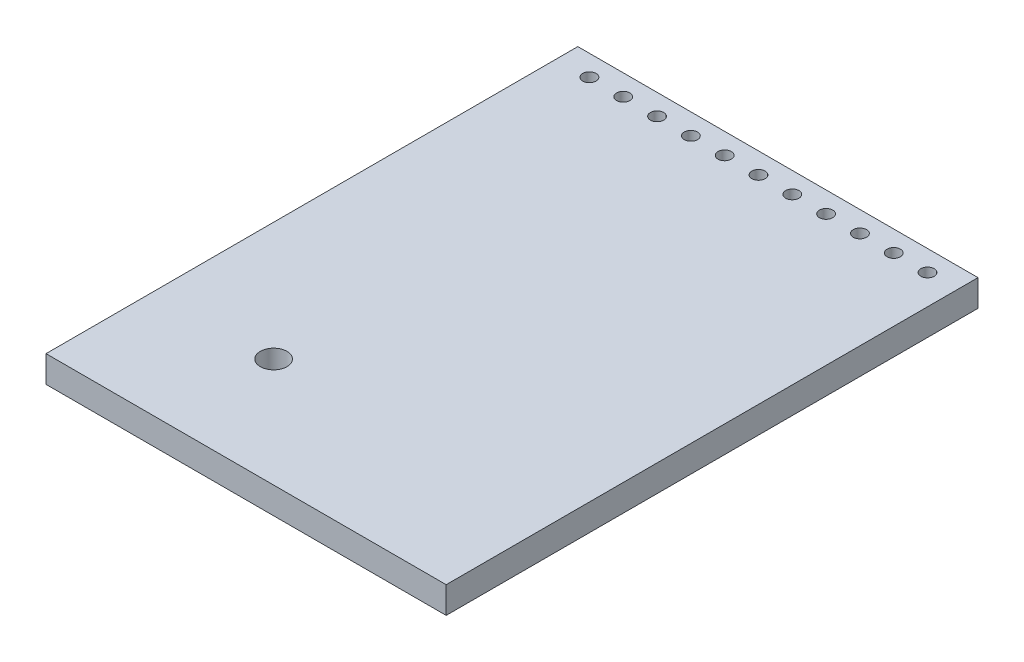
ISO-10303-21;
HEADER;
FILE_DESCRIPTION(('STEP AP214'),'2;1');
FILE_NAME('part.step','',(''),(''),'','','');
FILE_SCHEMA(('AUTOMOTIVE_DESIGN { 1 0 10303 214 1 1 1 1 }'));
ENDSEC;
DATA;
#1=APPLICATION_CONTEXT('core data for automotive mechanical design processes');
#2=APPLICATION_PROTOCOL_DEFINITION('international standard','automotive_design',2000,#1);
#3=PRODUCT_CONTEXT('',#1,'mechanical');
#4=PRODUCT('Part','Part','',(#3));
#5=PRODUCT_RELATED_PRODUCT_CATEGORY('part','',(#4));
#6=PRODUCT_DEFINITION_FORMATION('','',#4);
#7=PRODUCT_DEFINITION_CONTEXT('part definition',#1,'design');
#8=PRODUCT_DEFINITION('design','',#6,#7);
#9=PRODUCT_DEFINITION_SHAPE('','',#8);
#10=(LENGTH_UNIT() NAMED_UNIT(*) SI_UNIT(.MILLI.,.METRE.));
#11=(NAMED_UNIT(*) PLANE_ANGLE_UNIT() SI_UNIT($,.RADIAN.));
#12=(NAMED_UNIT(*) SI_UNIT($,.STERADIAN.) SOLID_ANGLE_UNIT());
#13=UNCERTAINTY_MEASURE_WITH_UNIT(LENGTH_MEASURE(1.E-05),#10,'distance_accuracy_value','');
#14=(GEOMETRIC_REPRESENTATION_CONTEXT(3) GLOBAL_UNCERTAINTY_ASSIGNED_CONTEXT((#13)) GLOBAL_UNIT_ASSIGNED_CONTEXT((#10,
#11,#12)) REPRESENTATION_CONTEXT('',''));
#15=CARTESIAN_POINT('',(0.,0.,0.));
#16=DIRECTION('',(0.,0.,1.));
#17=DIRECTION('',(1.,0.,0.));
#18=AXIS2_PLACEMENT_3D('',#15,#16,#17);
#19=CARTESIAN_POINT('',(0.,0.,39.95));
#20=DIRECTION('',(0.,1.,0.));
#21=DIRECTION('',(0.,0.,1.));
#22=AXIS2_PLACEMENT_3D('',#19,#20,#21);
#23=PLANE('',#22);
#24=DIRECTION('',(0.,0.,1.));
#25=VECTOR('',#24,1.);
#26=CARTESIAN_POINT('',(14.71,0.,37.2));
#27=LINE('',#26,#25);
#28=CARTESIAN_POINT('',(14.71,0.,35.2));
#29=VERTEX_POINT('',#28);
#30=CARTESIAN_POINT('',(14.71,0.,37.2));
#31=VERTEX_POINT('',#30);
#32=EDGE_CURVE('E149',#29,#31,#27,.T.);
#33=ORIENTED_EDGE('',*,*,#32,.F.);
#34=DIRECTION('',(1.,0.,0.));
#35=VECTOR('',#34,1.);
#36=CARTESIAN_POINT('',(14.71,0.,35.2));
#37=LINE('',#36,#35);
#38=CARTESIAN_POINT('',(13.41,0.,35.2));
#39=VERTEX_POINT('',#38);
#40=EDGE_CURVE('E162',#39,#29,#37,.T.);
#41=ORIENTED_EDGE('',*,*,#40,.F.);
#42=DIRECTION('',(0.,0.,-1.));
#43=VECTOR('',#42,1.);
#44=CARTESIAN_POINT('',(13.41,0.,37.2));
#45=LINE('',#44,#43);
#46=CARTESIAN_POINT('',(13.41,0.,37.2));
#47=VERTEX_POINT('',#46);
#48=EDGE_CURVE('E171',#47,#39,#45,.T.);
#49=ORIENTED_EDGE('',*,*,#48,.F.);
#50=DIRECTION('',(-1.,0.,0.));
#51=VECTOR('',#50,1.);
#52=CARTESIAN_POINT('',(14.71,0.,37.2));
#53=LINE('',#52,#51);
#54=EDGE_CURVE('E152',#31,#47,#53,.T.);
#55=ORIENTED_EDGE('',*,*,#54,.F.);
#56=EDGE_LOOP('',(#33,#41,#49,#55));
#57=FACE_BOUND('',#56,.T.);
#58=CARTESIAN_POINT('',(25.29,0.,1.56));
#59=DIRECTION('',(0.,1.,0.));
#60=DIRECTION('',(0.,0.,1.));
#61=AXIS2_PLACEMENT_3D('',#58,#59,#60);
#62=CIRCLE('',#61,0.499999999999999);
#63=CARTESIAN_POINT('',(25.29,0.,2.06));
#64=VERTEX_POINT('',#63);
#65=EDGE_CURVE('E190',#64,#64,#62,.T.);
#66=ORIENTED_EDGE('',*,*,#65,.T.);
#67=EDGE_LOOP('',(#66));
#68=FACE_BOUND('',#67,.T.);
#69=CARTESIAN_POINT('',(27.83,0.,1.56));
#70=DIRECTION('',(0.,1.,0.));
#71=DIRECTION('',(0.,0.,1.));
#72=AXIS2_PLACEMENT_3D('',#69,#70,#71);
#73=CIRCLE('',#72,0.499999999999999);
#74=CARTESIAN_POINT('',(27.83,0.,2.06));
#75=VERTEX_POINT('',#74);
#76=EDGE_CURVE('E196',#75,#75,#73,.T.);
#77=ORIENTED_EDGE('',*,*,#76,.T.);
#78=EDGE_LOOP('',(#77));
#79=FACE_BOUND('',#78,.T.);
#80=CARTESIAN_POINT('',(8.9,0.,31.75));
#81=DIRECTION('',(0.,1.,0.));
#82=DIRECTION('',(0.,0.,1.));
#83=AXIS2_PLACEMENT_3D('',#80,#81,#82);
#84=CIRCLE('',#83,1.);
#85=CARTESIAN_POINT('',(8.9,0.,32.75));
#86=VERTEX_POINT('',#85);
#87=EDGE_CURVE('E202',#86,#86,#84,.T.);
#88=ORIENTED_EDGE('',*,*,#87,.T.);
#89=EDGE_LOOP('',(#88));
#90=FACE_BOUND('',#89,.T.);
#91=DIRECTION('',(1.,0.,0.));
#92=VECTOR('',#91,1.);
#93=CARTESIAN_POINT('',(0.,0.,0.));
#94=LINE('',#93,#92);
#95=CARTESIAN_POINT('',(0.,0.,0.));
#96=VERTEX_POINT('',#95);
#97=CARTESIAN_POINT('',(30.06,0.,0.));
#98=VERTEX_POINT('',#97);
#99=EDGE_CURVE('E219',#96,#98,#94,.T.);
#100=ORIENTED_EDGE('',*,*,#99,.T.);
#101=DIRECTION('',(0.,0.,-1.));
#102=VECTOR('',#101,1.);
#103=CARTESIAN_POINT('',(30.06,0.,39.95));
#104=LINE('',#103,#102);
#105=CARTESIAN_POINT('',(30.06,0.,39.95));
#106=VERTEX_POINT('',#105);
#107=EDGE_CURVE('E229',#106,#98,#104,.T.);
#108=ORIENTED_EDGE('',*,*,#107,.F.);
#109=DIRECTION('',(1.,0.,0.));
#110=VECTOR('',#109,1.);
#111=CARTESIAN_POINT('',(0.,0.,39.95));
#112=LINE('',#111,#110);
#113=CARTESIAN_POINT('',(0.,0.,39.95));
#114=VERTEX_POINT('',#113);
#115=EDGE_CURVE('E209',#114,#106,#112,.T.);
#116=ORIENTED_EDGE('',*,*,#115,.F.);
#117=DIRECTION('',(0.,0.,-1.));
#118=VECTOR('',#117,1.);
#119=CARTESIAN_POINT('',(0.,0.,39.95));
#120=LINE('',#119,#118);
#121=EDGE_CURVE('E232',#114,#96,#120,.T.);
#122=ORIENTED_EDGE('',*,*,#121,.T.);
#123=EDGE_LOOP('',(#100,#108,#116,#122));
#124=FACE_BOUND('',#123,.T.);
#125=CARTESIAN_POINT('',(22.75,0.,1.56));
#126=DIRECTION('',(0.,1.,0.));
#127=DIRECTION('',(0.,0.,1.));
#128=AXIS2_PLACEMENT_3D('',#125,#126,#127);
#129=CIRCLE('',#128,0.499999999999999);
#130=CARTESIAN_POINT('',(22.75,0.,2.06));
#131=VERTEX_POINT('',#130);
#132=EDGE_CURVE('E238',#131,#131,#129,.T.);
#133=ORIENTED_EDGE('',*,*,#132,.T.);
#134=EDGE_LOOP('',(#133));
#135=FACE_BOUND('',#134,.T.);
#136=CARTESIAN_POINT('',(20.21,0.,1.56));
#137=DIRECTION('',(0.,1.,0.));
#138=DIRECTION('',(0.,0.,1.));
#139=AXIS2_PLACEMENT_3D('',#136,#137,#138);
#140=CIRCLE('',#139,0.499999999999999);
#141=CARTESIAN_POINT('',(20.21,0.,2.06));
#142=VERTEX_POINT('',#141);
#143=EDGE_CURVE('E244',#142,#142,#140,.T.);
#144=ORIENTED_EDGE('',*,*,#143,.T.);
#145=EDGE_LOOP('',(#144));
#146=FACE_BOUND('',#145,.T.);
#147=CARTESIAN_POINT('',(17.67,0.,1.56));
#148=DIRECTION('',(0.,1.,0.));
#149=DIRECTION('',(0.,0.,1.));
#150=AXIS2_PLACEMENT_3D('',#147,#148,#149);
#151=CIRCLE('',#150,0.499999999999999);
#152=CARTESIAN_POINT('',(17.67,0.,2.06));
#153=VERTEX_POINT('',#152);
#154=EDGE_CURVE('E250',#153,#153,#151,.T.);
#155=ORIENTED_EDGE('',*,*,#154,.T.);
#156=EDGE_LOOP('',(#155));
#157=FACE_BOUND('',#156,.T.);
#158=CARTESIAN_POINT('',(15.13,0.,1.56));
#159=DIRECTION('',(0.,1.,0.));
#160=DIRECTION('',(0.,0.,1.));
#161=AXIS2_PLACEMENT_3D('',#158,#159,#160);
#162=CIRCLE('',#161,0.499999999999999);
#163=CARTESIAN_POINT('',(15.13,0.,2.06));
#164=VERTEX_POINT('',#163);
#165=EDGE_CURVE('E256',#164,#164,#162,.T.);
#166=ORIENTED_EDGE('',*,*,#165,.T.);
#167=EDGE_LOOP('',(#166));
#168=FACE_BOUND('',#167,.T.);
#169=CARTESIAN_POINT('',(12.59,0.,1.56));
#170=DIRECTION('',(0.,1.,0.));
#171=DIRECTION('',(0.,0.,1.));
#172=AXIS2_PLACEMENT_3D('',#169,#170,#171);
#173=CIRCLE('',#172,0.499999999999999);
#174=CARTESIAN_POINT('',(12.59,0.,2.06));
#175=VERTEX_POINT('',#174);
#176=EDGE_CURVE('E262',#175,#175,#173,.T.);
#177=ORIENTED_EDGE('',*,*,#176,.T.);
#178=EDGE_LOOP('',(#177));
#179=FACE_BOUND('',#178,.T.);
#180=CARTESIAN_POINT('',(10.05,0.,1.56));
#181=DIRECTION('',(0.,1.,0.));
#182=DIRECTION('',(0.,0.,1.));
#183=AXIS2_PLACEMENT_3D('',#180,#181,#182);
#184=CIRCLE('',#183,0.499999999999999);
#185=CARTESIAN_POINT('',(10.05,0.,2.06));
#186=VERTEX_POINT('',#185);
#187=EDGE_CURVE('E268',#186,#186,#184,.T.);
#188=ORIENTED_EDGE('',*,*,#187,.T.);
#189=EDGE_LOOP('',(#188));
#190=FACE_BOUND('',#189,.T.);
#191=CARTESIAN_POINT('',(7.51,0.,1.56));
#192=DIRECTION('',(0.,1.,0.));
#193=DIRECTION('',(0.,0.,1.));
#194=AXIS2_PLACEMENT_3D('',#191,#192,#193);
#195=CIRCLE('',#194,0.499999999999999);
#196=CARTESIAN_POINT('',(7.51,0.,2.06));
#197=VERTEX_POINT('',#196);
#198=EDGE_CURVE('E274',#197,#197,#195,.T.);
#199=ORIENTED_EDGE('',*,*,#198,.T.);
#200=EDGE_LOOP('',(#199));
#201=FACE_BOUND('',#200,.T.);
#202=CARTESIAN_POINT('',(4.97,0.,1.56));
#203=DIRECTION('',(0.,1.,0.));
#204=DIRECTION('',(0.,0.,1.));
#205=AXIS2_PLACEMENT_3D('',#202,#203,#204);
#206=CIRCLE('',#205,0.499999999999999);
#207=CARTESIAN_POINT('',(4.97,0.,2.06));
#208=VERTEX_POINT('',#207);
#209=EDGE_CURVE('E280',#208,#208,#206,.T.);
#210=ORIENTED_EDGE('',*,*,#209,.T.);
#211=EDGE_LOOP('',(#210));
#212=FACE_BOUND('',#211,.T.);
#213=CARTESIAN_POINT('',(2.43,0.,1.56));
#214=DIRECTION('',(0.,1.,0.));
#215=DIRECTION('',(0.,0.,1.));
#216=AXIS2_PLACEMENT_3D('',#213,#214,#215);
#217=CIRCLE('',#216,0.499999999999999);
#218=CARTESIAN_POINT('',(2.43,0.,2.06));
#219=VERTEX_POINT('',#218);
#220=EDGE_CURVE('E11',#219,#219,#217,.T.);
#221=ORIENTED_EDGE('',*,*,#220,.T.);
#222=EDGE_LOOP('',(#221));
#223=FACE_BOUND('',#222,.T.);
#224=DIRECTION('',(0.,0.,1.));
#225=VECTOR('',#224,1.);
#226=CARTESIAN_POINT('',(4.76,0.,37.36));
#227=LINE('',#226,#225);
#228=CARTESIAN_POINT('',(4.76,0.,36.36));
#229=VERTEX_POINT('',#228);
#230=CARTESIAN_POINT('',(4.76,0.,37.36));
#231=VERTEX_POINT('',#230);
#232=EDGE_CURVE('E148',#229,#231,#227,.T.);
#233=ORIENTED_EDGE('',*,*,#232,.F.);
#234=DIRECTION('',(1.,0.,0.));
#235=VECTOR('',#234,1.);
#236=CARTESIAN_POINT('',(4.76,0.,36.36));
#237=LINE('',#236,#235);
#238=CARTESIAN_POINT('',(3.76,0.,36.36));
#239=VERTEX_POINT('',#238);
#240=EDGE_CURVE('E145',#239,#229,#237,.T.);
#241=ORIENTED_EDGE('',*,*,#240,.F.);
#242=DIRECTION('',(0.,0.,-1.));
#243=VECTOR('',#242,1.);
#244=CARTESIAN_POINT('',(3.76,0.,37.36));
#245=LINE('',#244,#243);
#246=CARTESIAN_POINT('',(3.76,0.,37.36));
#247=VERTEX_POINT('',#246);
#248=EDGE_CURVE('E59',#247,#239,#245,.T.);
#249=ORIENTED_EDGE('',*,*,#248,.F.);
#250=DIRECTION('',(-1.,0.,0.));
#251=VECTOR('',#250,1.);
#252=CARTESIAN_POINT('',(4.76,0.,37.36));
#253=LINE('',#252,#251);
#254=EDGE_CURVE('E54',#231,#247,#253,.T.);
#255=ORIENTED_EDGE('',*,*,#254,.F.);
#256=EDGE_LOOP('',(#233,#241,#249,#255));
#257=FACE_BOUND('',#256,.T.);
#258=ADVANCED_FACE('F39',(#57,#68,#79,#90,#124,#135,#146,#157,#168,#179,#190,#201,#212,#223,
#257),#23,.F.);
#259=CARTESIAN_POINT('',(0.,0.,39.95));
#260=DIRECTION('',(1.,0.,0.));
#261=DIRECTION('',(0.,0.,-1.));
#262=AXIS2_PLACEMENT_3D('',#259,#260,#261);
#263=PLANE('',#262);
#264=DIRECTION('',(0.,-1.,0.));
#265=VECTOR('',#264,1.);
#266=CARTESIAN_POINT('',(0.,0.,0.));
#267=LINE('',#266,#265);
#268=CARTESIAN_POINT('',(0.,2.,0.));
#269=VERTEX_POINT('',#268);
#270=EDGE_CURVE('E205',#269,#96,#267,.T.);
#271=ORIENTED_EDGE('',*,*,#270,.T.);
#272=ORIENTED_EDGE('',*,*,#121,.F.);
#273=DIRECTION('',(0.,-1.,0.));
#274=VECTOR('',#273,1.);
#275=CARTESIAN_POINT('',(0.,0.,39.95));
#276=LINE('',#275,#274);
#277=CARTESIAN_POINT('',(0.,2.,39.95));
#278=VERTEX_POINT('',#277);
#279=EDGE_CURVE('E206',#278,#114,#276,.T.);
#280=ORIENTED_EDGE('',*,*,#279,.F.);
#281=DIRECTION('',(0.,0.,-1.));
#282=VECTOR('',#281,1.);
#283=CARTESIAN_POINT('',(0.,2.,39.95));
#284=LINE('',#283,#282);
#285=EDGE_CURVE('E216',#278,#269,#284,.T.);
#286=ORIENTED_EDGE('',*,*,#285,.T.);
#287=EDGE_LOOP('',(#271,#272,#280,#286));
#288=FACE_BOUND('',#287,.T.);
#289=ADVANCED_FACE('F302',(#288),#263,.F.);
#290=CARTESIAN_POINT('',(30.06,0.,39.95));
#291=DIRECTION('',(-1.,0.,0.));
#292=DIRECTION('',(0.,0.,1.));
#293=AXIS2_PLACEMENT_3D('',#290,#291,#292);
#294=PLANE('',#293);
#295=DIRECTION('',(0.,1.,0.));
#296=VECTOR('',#295,1.);
#297=CARTESIAN_POINT('',(30.06,0.,0.));
#298=LINE('',#297,#296);
#299=CARTESIAN_POINT('',(30.06,2.,0.));
#300=VERTEX_POINT('',#299);
#301=EDGE_CURVE('E221',#98,#300,#298,.T.);
#302=ORIENTED_EDGE('',*,*,#301,.T.);
#303=DIRECTION('',(0.,0.,-1.));
#304=VECTOR('',#303,1.);
#305=CARTESIAN_POINT('',(30.06,2.,39.95));
#306=LINE('',#305,#304);
#307=CARTESIAN_POINT('',(30.06,2.,39.95));
#308=VERTEX_POINT('',#307);
#309=EDGE_CURVE('E226',#308,#300,#306,.T.);
#310=ORIENTED_EDGE('',*,*,#309,.F.);
#311=DIRECTION('',(0.,1.,0.));
#312=VECTOR('',#311,1.);
#313=CARTESIAN_POINT('',(30.06,0.,39.95));
#314=LINE('',#313,#312);
#315=EDGE_CURVE('E212',#106,#308,#314,.T.);
#316=ORIENTED_EDGE('',*,*,#315,.F.);
#317=ORIENTED_EDGE('',*,*,#107,.T.);
#318=EDGE_LOOP('',(#302,#310,#316,#317));
#319=FACE_BOUND('',#318,.T.);
#320=ADVANCED_FACE('F290',(#319),#294,.F.);
#321=CARTESIAN_POINT('',(0.,2.,39.95));
#322=DIRECTION('',(0.,-1.,0.));
#323=DIRECTION('',(0.,0.,-1.));
#324=AXIS2_PLACEMENT_3D('',#321,#322,#323);
#325=PLANE('',#324);
#326=CARTESIAN_POINT('',(25.29,2.,1.56));
#327=DIRECTION('',(0.,1.,0.));
#328=DIRECTION('',(0.,0.,1.));
#329=AXIS2_PLACEMENT_3D('',#326,#327,#328);
#330=CIRCLE('',#329,0.499999999999999);
#331=CARTESIAN_POINT('',(25.29,2.,2.06));
#332=VERTEX_POINT('',#331);
#333=EDGE_CURVE('E187',#332,#332,#330,.T.);
#334=ORIENTED_EDGE('',*,*,#333,.F.);
#335=EDGE_LOOP('',(#334));
#336=FACE_BOUND('',#335,.T.);
#337=CARTESIAN_POINT('',(27.83,2.,1.56));
#338=DIRECTION('',(0.,1.,0.));
#339=DIRECTION('',(0.,0.,1.));
#340=AXIS2_PLACEMENT_3D('',#337,#338,#339);
#341=CIRCLE('',#340,0.499999999999999);
#342=CARTESIAN_POINT('',(27.83,2.,2.06));
#343=VERTEX_POINT('',#342);
#344=EDGE_CURVE('E193',#343,#343,#341,.T.);
#345=ORIENTED_EDGE('',*,*,#344,.F.);
#346=EDGE_LOOP('',(#345));
#347=FACE_BOUND('',#346,.T.);
#348=CARTESIAN_POINT('',(8.9,2.,31.75));
#349=DIRECTION('',(0.,1.,0.));
#350=DIRECTION('',(0.,0.,1.));
#351=AXIS2_PLACEMENT_3D('',#348,#349,#350);
#352=CIRCLE('',#351,1.);
#353=CARTESIAN_POINT('',(8.9,2.,32.75));
#354=VERTEX_POINT('',#353);
#355=EDGE_CURVE('E199',#354,#354,#352,.T.);
#356=ORIENTED_EDGE('',*,*,#355,.F.);
#357=EDGE_LOOP('',(#356));
#358=FACE_BOUND('',#357,.T.);
#359=DIRECTION('',(-1.,0.,0.));
#360=VECTOR('',#359,1.);
#361=CARTESIAN_POINT('',(0.,2.,0.));
#362=LINE('',#361,#360);
#363=EDGE_CURVE('E210',#300,#269,#362,.T.);
#364=ORIENTED_EDGE('',*,*,#363,.T.);
#365=ORIENTED_EDGE('',*,*,#285,.F.);
#366=DIRECTION('',(-1.,0.,0.));
#367=VECTOR('',#366,1.);
#368=CARTESIAN_POINT('',(0.,2.,39.95));
#369=LINE('',#368,#367);
#370=EDGE_CURVE('E214',#308,#278,#369,.T.);
#371=ORIENTED_EDGE('',*,*,#370,.F.);
#372=ORIENTED_EDGE('',*,*,#309,.T.);
#373=EDGE_LOOP('',(#364,#365,#371,#372));
#374=FACE_BOUND('',#373,.T.);
#375=CARTESIAN_POINT('',(22.75,2.,1.56));
#376=DIRECTION('',(0.,1.,0.));
#377=DIRECTION('',(0.,0.,1.));
#378=AXIS2_PLACEMENT_3D('',#375,#376,#377);
#379=CIRCLE('',#378,0.499999999999999);
#380=CARTESIAN_POINT('',(22.75,2.,2.06));
#381=VERTEX_POINT('',#380);
#382=EDGE_CURVE('E235',#381,#381,#379,.T.);
#383=ORIENTED_EDGE('',*,*,#382,.F.);
#384=EDGE_LOOP('',(#383));
#385=FACE_BOUND('',#384,.T.);
#386=CARTESIAN_POINT('',(20.21,2.,1.56));
#387=DIRECTION('',(0.,1.,0.));
#388=DIRECTION('',(0.,0.,1.));
#389=AXIS2_PLACEMENT_3D('',#386,#387,#388);
#390=CIRCLE('',#389,0.499999999999999);
#391=CARTESIAN_POINT('',(20.21,2.,2.06));
#392=VERTEX_POINT('',#391);
#393=EDGE_CURVE('E241',#392,#392,#390,.T.);
#394=ORIENTED_EDGE('',*,*,#393,.F.);
#395=EDGE_LOOP('',(#394));
#396=FACE_BOUND('',#395,.T.);
#397=CARTESIAN_POINT('',(17.67,2.,1.56));
#398=DIRECTION('',(0.,1.,0.));
#399=DIRECTION('',(0.,0.,1.));
#400=AXIS2_PLACEMENT_3D('',#397,#398,#399);
#401=CIRCLE('',#400,0.499999999999999);
#402=CARTESIAN_POINT('',(17.67,2.,2.06));
#403=VERTEX_POINT('',#402);
#404=EDGE_CURVE('E247',#403,#403,#401,.T.);
#405=ORIENTED_EDGE('',*,*,#404,.F.);
#406=EDGE_LOOP('',(#405));
#407=FACE_BOUND('',#406,.T.);
#408=CARTESIAN_POINT('',(15.13,2.,1.56));
#409=DIRECTION('',(0.,1.,0.));
#410=DIRECTION('',(0.,0.,1.));
#411=AXIS2_PLACEMENT_3D('',#408,#409,#410);
#412=CIRCLE('',#411,0.499999999999999);
#413=CARTESIAN_POINT('',(15.13,2.,2.06));
#414=VERTEX_POINT('',#413);
#415=EDGE_CURVE('E253',#414,#414,#412,.T.);
#416=ORIENTED_EDGE('',*,*,#415,.F.);
#417=EDGE_LOOP('',(#416));
#418=FACE_BOUND('',#417,.T.);
#419=CARTESIAN_POINT('',(12.59,2.,1.56));
#420=DIRECTION('',(0.,1.,0.));
#421=DIRECTION('',(0.,0.,1.));
#422=AXIS2_PLACEMENT_3D('',#419,#420,#421);
#423=CIRCLE('',#422,0.499999999999999);
#424=CARTESIAN_POINT('',(12.59,2.,2.06));
#425=VERTEX_POINT('',#424);
#426=EDGE_CURVE('E259',#425,#425,#423,.T.);
#427=ORIENTED_EDGE('',*,*,#426,.F.);
#428=EDGE_LOOP('',(#427));
#429=FACE_BOUND('',#428,.T.);
#430=CARTESIAN_POINT('',(10.05,2.,1.56));
#431=DIRECTION('',(0.,1.,0.));
#432=DIRECTION('',(0.,0.,1.));
#433=AXIS2_PLACEMENT_3D('',#430,#431,#432);
#434=CIRCLE('',#433,0.499999999999999);
#435=CARTESIAN_POINT('',(10.05,2.,2.06));
#436=VERTEX_POINT('',#435);
#437=EDGE_CURVE('E265',#436,#436,#434,.T.);
#438=ORIENTED_EDGE('',*,*,#437,.F.);
#439=EDGE_LOOP('',(#438));
#440=FACE_BOUND('',#439,.T.);
#441=CARTESIAN_POINT('',(7.51,2.,1.56));
#442=DIRECTION('',(0.,1.,0.));
#443=DIRECTION('',(0.,0.,1.));
#444=AXIS2_PLACEMENT_3D('',#441,#442,#443);
#445=CIRCLE('',#444,0.499999999999999);
#446=CARTESIAN_POINT('',(7.51,2.,2.06));
#447=VERTEX_POINT('',#446);
#448=EDGE_CURVE('E271',#447,#447,#445,.T.);
#449=ORIENTED_EDGE('',*,*,#448,.F.);
#450=EDGE_LOOP('',(#449));
#451=FACE_BOUND('',#450,.T.);
#452=CARTESIAN_POINT('',(4.97,2.,1.56));
#453=DIRECTION('',(0.,1.,0.));
#454=DIRECTION('',(0.,0.,1.));
#455=AXIS2_PLACEMENT_3D('',#452,#453,#454);
#456=CIRCLE('',#455,0.499999999999999);
#457=CARTESIAN_POINT('',(4.97,2.,2.06));
#458=VERTEX_POINT('',#457);
#459=EDGE_CURVE('E277',#458,#458,#456,.T.);
#460=ORIENTED_EDGE('',*,*,#459,.F.);
#461=EDGE_LOOP('',(#460));
#462=FACE_BOUND('',#461,.T.);
#463=CARTESIAN_POINT('',(2.43,2.,1.56));
#464=DIRECTION('',(0.,1.,0.));
#465=DIRECTION('',(0.,0.,1.));
#466=AXIS2_PLACEMENT_3D('',#463,#464,#465);
#467=CIRCLE('',#466,0.499999999999999);
#468=CARTESIAN_POINT('',(2.43,2.,2.06));
#469=VERTEX_POINT('',#468);
#470=EDGE_CURVE('E47',#469,#469,#467,.T.);
#471=ORIENTED_EDGE('',*,*,#470,.F.);
#472=EDGE_LOOP('',(#471));
#473=FACE_BOUND('',#472,.T.);
#474=ADVANCED_FACE('F287',(#336,#347,#358,#374,#385,#396,#407,#418,#429,#440,#451,#462,#473),
#325,.F.);
#475=CARTESIAN_POINT('',(0.,0.,39.95));
#476=DIRECTION('',(0.,0.,-1.));
#477=DIRECTION('',(-1.,0.,0.));
#478=AXIS2_PLACEMENT_3D('',#475,#476,#477);
#479=PLANE('',#478);
#480=ORIENTED_EDGE('',*,*,#279,.T.);
#481=ORIENTED_EDGE('',*,*,#115,.T.);
#482=ORIENTED_EDGE('',*,*,#315,.T.);
#483=ORIENTED_EDGE('',*,*,#370,.T.);
#484=EDGE_LOOP('',(#480,#481,#482,#483));
#485=FACE_BOUND('',#484,.T.);
#486=ADVANCED_FACE('F289',(#485),#479,.F.);
#487=CARTESIAN_POINT('',(0.,0.,0.));
#488=DIRECTION('',(0.,0.,-1.));
#489=DIRECTION('',(-1.,0.,0.));
#490=AXIS2_PLACEMENT_3D('',#487,#488,#489);
#491=PLANE('',#490);
#492=ORIENTED_EDGE('',*,*,#270,.F.);
#493=ORIENTED_EDGE('',*,*,#363,.F.);
#494=ORIENTED_EDGE('',*,*,#301,.F.);
#495=ORIENTED_EDGE('',*,*,#99,.F.);
#496=EDGE_LOOP('',(#492,#493,#494,#495));
#497=FACE_BOUND('',#496,.T.);
#498=ADVANCED_FACE('F298',(#497),#491,.T.);
#499=CARTESIAN_POINT('',(8.9,-37.95,31.75));
#500=DIRECTION('',(0.,1.,0.));
#501=DIRECTION('',(0.,0.,1.));
#502=AXIS2_PLACEMENT_3D('',#499,#500,#501);
#503=CYLINDRICAL_SURFACE('',#502,1.);
#504=ORIENTED_EDGE('',*,*,#355,.T.);
#505=EDGE_LOOP('',(#504));
#506=FACE_BOUND('',#505,.T.);
#507=ORIENTED_EDGE('',*,*,#87,.F.);
#508=EDGE_LOOP('',(#507));
#509=FACE_BOUND('',#508,.T.);
#510=ADVANCED_FACE('F412',(#506,#509),#503,.F.);
#511=CARTESIAN_POINT('',(27.83,-2.5,1.56));
#512=DIRECTION('',(0.,1.,0.));
#513=DIRECTION('',(0.,0.,1.));
#514=AXIS2_PLACEMENT_3D('',#511,#512,#513);
#515=CYLINDRICAL_SURFACE('',#514,0.499999999999999);
#516=ORIENTED_EDGE('',*,*,#344,.T.);
#517=EDGE_LOOP('',(#516));
#518=FACE_BOUND('',#517,.T.);
#519=ORIENTED_EDGE('',*,*,#76,.F.);
#520=EDGE_LOOP('',(#519));
#521=FACE_BOUND('',#520,.T.);
#522=ADVANCED_FACE('F408',(#518,#521),#515,.F.);
#523=CARTESIAN_POINT('',(25.29,-2.5,1.56));
#524=DIRECTION('',(0.,1.,0.));
#525=DIRECTION('',(0.,0.,1.));
#526=AXIS2_PLACEMENT_3D('',#523,#524,#525);
#527=CYLINDRICAL_SURFACE('',#526,0.499999999999999);
#528=ORIENTED_EDGE('',*,*,#333,.T.);
#529=EDGE_LOOP('',(#528));
#530=FACE_BOUND('',#529,.T.);
#531=ORIENTED_EDGE('',*,*,#65,.F.);
#532=EDGE_LOOP('',(#531));
#533=FACE_BOUND('',#532,.T.);
#534=ADVANCED_FACE('F324',(#530,#533),#527,.F.);
#535=CARTESIAN_POINT('',(22.75,-2.5,1.56));
#536=DIRECTION('',(0.,1.,0.));
#537=DIRECTION('',(0.,0.,1.));
#538=AXIS2_PLACEMENT_3D('',#535,#536,#537);
#539=CYLINDRICAL_SURFACE('',#538,0.499999999999999);
#540=ORIENTED_EDGE('',*,*,#382,.T.);
#541=EDGE_LOOP('',(#540));
#542=FACE_BOUND('',#541,.T.);
#543=ORIENTED_EDGE('',*,*,#132,.F.);
#544=EDGE_LOOP('',(#543));
#545=FACE_BOUND('',#544,.T.);
#546=ADVANCED_FACE('F320',(#542,#545),#539,.F.);
#547=CARTESIAN_POINT('',(20.21,-2.5,1.56));
#548=DIRECTION('',(0.,1.,0.));
#549=DIRECTION('',(0.,0.,1.));
#550=AXIS2_PLACEMENT_3D('',#547,#548,#549);
#551=CYLINDRICAL_SURFACE('',#550,0.499999999999999);
#552=ORIENTED_EDGE('',*,*,#393,.T.);
#553=EDGE_LOOP('',(#552));
#554=FACE_BOUND('',#553,.T.);
#555=ORIENTED_EDGE('',*,*,#143,.F.);
#556=EDGE_LOOP('',(#555));
#557=FACE_BOUND('',#556,.T.);
#558=ADVANCED_FACE('F323',(#554,#557),#551,.F.);
#559=CARTESIAN_POINT('',(17.67,-2.5,1.56));
#560=DIRECTION('',(0.,1.,0.));
#561=DIRECTION('',(0.,0.,1.));
#562=AXIS2_PLACEMENT_3D('',#559,#560,#561);
#563=CYLINDRICAL_SURFACE('',#562,0.499999999999999);
#564=ORIENTED_EDGE('',*,*,#404,.T.);
#565=EDGE_LOOP('',(#564));
#566=FACE_BOUND('',#565,.T.);
#567=ORIENTED_EDGE('',*,*,#154,.F.);
#568=EDGE_LOOP('',(#567));
#569=FACE_BOUND('',#568,.T.);
#570=ADVANCED_FACE('F328',(#566,#569),#563,.F.);
#571=CARTESIAN_POINT('',(15.13,-2.5,1.56));
#572=DIRECTION('',(0.,1.,0.));
#573=DIRECTION('',(0.,0.,1.));
#574=AXIS2_PLACEMENT_3D('',#571,#572,#573);
#575=CYLINDRICAL_SURFACE('',#574,0.499999999999999);
#576=ORIENTED_EDGE('',*,*,#415,.T.);
#577=EDGE_LOOP('',(#576));
#578=FACE_BOUND('',#577,.T.);
#579=ORIENTED_EDGE('',*,*,#165,.F.);
#580=EDGE_LOOP('',(#579));
#581=FACE_BOUND('',#580,.T.);
#582=ADVANCED_FACE('F332',(#578,#581),#575,.F.);
#583=CARTESIAN_POINT('',(12.59,-2.5,1.56));
#584=DIRECTION('',(0.,1.,0.));
#585=DIRECTION('',(0.,0.,1.));
#586=AXIS2_PLACEMENT_3D('',#583,#584,#585);
#587=CYLINDRICAL_SURFACE('',#586,0.499999999999999);
#588=ORIENTED_EDGE('',*,*,#426,.T.);
#589=EDGE_LOOP('',(#588));
#590=FACE_BOUND('',#589,.T.);
#591=ORIENTED_EDGE('',*,*,#176,.F.);
#592=EDGE_LOOP('',(#591));
#593=FACE_BOUND('',#592,.T.);
#594=ADVANCED_FACE('F336',(#590,#593),#587,.F.);
#595=CARTESIAN_POINT('',(10.05,-2.5,1.56));
#596=DIRECTION('',(0.,1.,0.));
#597=DIRECTION('',(0.,0.,1.));
#598=AXIS2_PLACEMENT_3D('',#595,#596,#597);
#599=CYLINDRICAL_SURFACE('',#598,0.499999999999999);
#600=ORIENTED_EDGE('',*,*,#437,.T.);
#601=EDGE_LOOP('',(#600));
#602=FACE_BOUND('',#601,.T.);
#603=ORIENTED_EDGE('',*,*,#187,.F.);
#604=EDGE_LOOP('',(#603));
#605=FACE_BOUND('',#604,.T.);
#606=ADVANCED_FACE('F340',(#602,#605),#599,.F.);
#607=CARTESIAN_POINT('',(7.51,-2.5,1.56));
#608=DIRECTION('',(0.,1.,0.));
#609=DIRECTION('',(0.,0.,1.));
#610=AXIS2_PLACEMENT_3D('',#607,#608,#609);
#611=CYLINDRICAL_SURFACE('',#610,0.499999999999999);
#612=ORIENTED_EDGE('',*,*,#448,.T.);
#613=EDGE_LOOP('',(#612));
#614=FACE_BOUND('',#613,.T.);
#615=ORIENTED_EDGE('',*,*,#198,.F.);
#616=EDGE_LOOP('',(#615));
#617=FACE_BOUND('',#616,.T.);
#618=ADVANCED_FACE('F344',(#614,#617),#611,.F.);
#619=CARTESIAN_POINT('',(4.97,-2.5,1.56));
#620=DIRECTION('',(0.,1.,0.));
#621=DIRECTION('',(0.,0.,1.));
#622=AXIS2_PLACEMENT_3D('',#619,#620,#621);
#623=CYLINDRICAL_SURFACE('',#622,0.499999999999999);
#624=ORIENTED_EDGE('',*,*,#459,.T.);
#625=EDGE_LOOP('',(#624));
#626=FACE_BOUND('',#625,.T.);
#627=ORIENTED_EDGE('',*,*,#209,.F.);
#628=EDGE_LOOP('',(#627));
#629=FACE_BOUND('',#628,.T.);
#630=ADVANCED_FACE('F347',(#626,#629),#623,.F.);
#631=CARTESIAN_POINT('',(2.43,-2.5,1.56));
#632=DIRECTION('',(0.,1.,0.));
#633=DIRECTION('',(0.,0.,1.));
#634=AXIS2_PLACEMENT_3D('',#631,#632,#633);
#635=CYLINDRICAL_SURFACE('',#634,0.499999999999999);
#636=ORIENTED_EDGE('',*,*,#470,.T.);
#637=EDGE_LOOP('',(#636));
#638=FACE_BOUND('',#637,.T.);
#639=ORIENTED_EDGE('',*,*,#220,.F.);
#640=EDGE_LOOP('',(#639));
#641=FACE_BOUND('',#640,.T.);
#642=ADVANCED_FACE('F41',(#638,#641),#635,.F.);
#643=CARTESIAN_POINT('',(14.71,-0.2,37.2));
#644=DIRECTION('',(-1.,0.,0.));
#645=DIRECTION('',(0.,0.,1.));
#646=AXIS2_PLACEMENT_3D('',#643,#644,#645);
#647=PLANE('',#646);
#648=ORIENTED_EDGE('',*,*,#32,.T.);
#649=DIRECTION('',(0.,1.,0.));
#650=VECTOR('',#649,1.);
#651=CARTESIAN_POINT('',(14.71,-0.2,37.2));
#652=LINE('',#651,#650);
#653=CARTESIAN_POINT('',(14.71,-0.2,37.2));
#654=VERTEX_POINT('',#653);
#655=EDGE_CURVE('E184',#654,#31,#652,.T.);
#656=ORIENTED_EDGE('',*,*,#655,.F.);
#657=DIRECTION('',(0.,0.,1.));
#658=VECTOR('',#657,1.);
#659=CARTESIAN_POINT('',(14.71,-0.2,37.2));
#660=LINE('',#659,#658);
#661=CARTESIAN_POINT('',(14.71,-0.2,35.2));
#662=VERTEX_POINT('',#661);
#663=EDGE_CURVE('E158',#662,#654,#660,.T.);
#664=ORIENTED_EDGE('',*,*,#663,.F.);
#665=DIRECTION('',(0.,1.,0.));
#666=VECTOR('',#665,1.);
#667=CARTESIAN_POINT('',(14.71,-0.2,35.2));
#668=LINE('',#667,#666);
#669=EDGE_CURVE('E167',#662,#29,#668,.T.);
#670=ORIENTED_EDGE('',*,*,#669,.T.);
#671=EDGE_LOOP('',(#648,#656,#664,#670));
#672=FACE_BOUND('',#671,.T.);
#673=ADVANCED_FACE('F354',(#672),#647,.F.);
#674=CARTESIAN_POINT('',(14.71,-0.2,37.2));
#675=DIRECTION('',(0.,0.,-1.));
#676=DIRECTION('',(-1.,0.,0.));
#677=AXIS2_PLACEMENT_3D('',#674,#675,#676);
#678=PLANE('',#677);
#679=ORIENTED_EDGE('',*,*,#54,.T.);
#680=DIRECTION('',(0.,1.,0.));
#681=VECTOR('',#680,1.);
#682=CARTESIAN_POINT('',(13.41,-0.2,37.2));
#683=LINE('',#682,#681);
#684=CARTESIAN_POINT('',(13.41,-0.2,37.2));
#685=VERTEX_POINT('',#684);
#686=EDGE_CURVE('E181',#685,#47,#683,.T.);
#687=ORIENTED_EDGE('',*,*,#686,.F.);
#688=DIRECTION('',(-1.,0.,0.));
#689=VECTOR('',#688,1.);
#690=CARTESIAN_POINT('',(14.71,-0.2,37.2));
#691=LINE('',#690,#689);
#692=EDGE_CURVE('E161',#654,#685,#691,.T.);
#693=ORIENTED_EDGE('',*,*,#692,.F.);
#694=ORIENTED_EDGE('',*,*,#655,.T.);
#695=EDGE_LOOP('',(#679,#687,#693,#694));
#696=FACE_BOUND('',#695,.T.);
#697=ADVANCED_FACE('F399',(#696),#678,.F.);
#698=CARTESIAN_POINT('',(13.41,-0.2,37.2));
#699=DIRECTION('',(1.,0.,0.));
#700=DIRECTION('',(0.,0.,-1.));
#701=AXIS2_PLACEMENT_3D('',#698,#699,#700);
#702=PLANE('',#701);
#703=ORIENTED_EDGE('',*,*,#48,.T.);
#704=DIRECTION('',(0.,1.,0.));
#705=VECTOR('',#704,1.);
#706=CARTESIAN_POINT('',(13.41,-0.2,35.2));
#707=LINE('',#706,#705);
#708=CARTESIAN_POINT('',(13.41,-0.2,35.2));
#709=VERTEX_POINT('',#708);
#710=EDGE_CURVE('E178',#709,#39,#707,.T.);
#711=ORIENTED_EDGE('',*,*,#710,.F.);
#712=DIRECTION('',(0.,0.,-1.));
#713=VECTOR('',#712,1.);
#714=CARTESIAN_POINT('',(13.41,-0.2,37.2));
#715=LINE('',#714,#713);
#716=EDGE_CURVE('E164',#685,#709,#715,.T.);
#717=ORIENTED_EDGE('',*,*,#716,.F.);
#718=ORIENTED_EDGE('',*,*,#686,.T.);
#719=EDGE_LOOP('',(#703,#711,#717,#718));
#720=FACE_BOUND('',#719,.T.);
#721=ADVANCED_FACE('F395',(#720),#702,.F.);
#722=CARTESIAN_POINT('',(14.71,-0.2,35.2));
#723=DIRECTION('',(0.,0.,1.));
#724=DIRECTION('',(1.,0.,0.));
#725=AXIS2_PLACEMENT_3D('',#722,#723,#724);
#726=PLANE('',#725);
#727=ORIENTED_EDGE('',*,*,#40,.T.);
#728=ORIENTED_EDGE('',*,*,#669,.F.);
#729=DIRECTION('',(1.,0.,0.));
#730=VECTOR('',#729,1.);
#731=CARTESIAN_POINT('',(14.71,-0.2,35.2));
#732=LINE('',#731,#730);
#733=EDGE_CURVE('E166',#709,#662,#732,.T.);
#734=ORIENTED_EDGE('',*,*,#733,.F.);
#735=ORIENTED_EDGE('',*,*,#710,.T.);
#736=EDGE_LOOP('',(#727,#728,#734,#735));
#737=FACE_BOUND('',#736,.T.);
#738=ADVANCED_FACE('F391',(#737),#726,.F.);
#739=CARTESIAN_POINT('',(0.,-0.2,0.));
#740=DIRECTION('',(0.,1.,0.));
#741=DIRECTION('',(0.,0.,1.));
#742=AXIS2_PLACEMENT_3D('',#739,#740,#741);
#743=PLANE('',#742);
#744=ORIENTED_EDGE('',*,*,#663,.T.);
#745=ORIENTED_EDGE('',*,*,#692,.T.);
#746=ORIENTED_EDGE('',*,*,#716,.T.);
#747=ORIENTED_EDGE('',*,*,#733,.T.);
#748=EDGE_LOOP('',(#744,#745,#746,#747));
#749=FACE_BOUND('',#748,.T.);
#750=ADVANCED_FACE('F388',(#749),#743,.F.);
#751=CARTESIAN_POINT('',(4.76,-0.2,37.36));
#752=DIRECTION('',(-1.,0.,0.));
#753=DIRECTION('',(0.,0.,1.));
#754=AXIS2_PLACEMENT_3D('',#751,#752,#753);
#755=PLANE('',#754);
#756=ORIENTED_EDGE('',*,*,#232,.T.);
#757=DIRECTION('',(0.,1.,0.));
#758=VECTOR('',#757,1.);
#759=CARTESIAN_POINT('',(4.76,-0.2,37.36));
#760=LINE('',#759,#758);
#761=CARTESIAN_POINT('',(4.76,-0.2,37.36));
#762=VERTEX_POINT('',#761);
#763=EDGE_CURVE('E129',#762,#231,#760,.T.);
#764=ORIENTED_EDGE('',*,*,#763,.F.);
#765=DIRECTION('',(0.,0.,1.));
#766=VECTOR('',#765,1.);
#767=CARTESIAN_POINT('',(4.76,-0.2,37.36));
#768=LINE('',#767,#766);
#769=CARTESIAN_POINT('',(4.76,-0.2,36.36));
#770=VERTEX_POINT('',#769);
#771=EDGE_CURVE('E136',#770,#762,#768,.T.);
#772=ORIENTED_EDGE('',*,*,#771,.F.);
#773=DIRECTION('',(0.,1.,0.));
#774=VECTOR('',#773,1.);
#775=CARTESIAN_POINT('',(4.76,-0.2,36.36));
#776=LINE('',#775,#774);
#777=EDGE_CURVE('E366',#770,#229,#776,.T.);
#778=ORIENTED_EDGE('',*,*,#777,.T.);
#779=EDGE_LOOP('',(#756,#764,#772,#778));
#780=FACE_BOUND('',#779,.T.);
#781=ADVANCED_FACE('F147',(#780),#755,.F.);
#782=CARTESIAN_POINT('',(4.76,-0.2,37.36));
#783=DIRECTION('',(0.,0.,-1.));
#784=DIRECTION('',(-1.,0.,0.));
#785=AXIS2_PLACEMENT_3D('',#782,#783,#784);
#786=PLANE('',#785);
#787=ORIENTED_EDGE('',*,*,#254,.T.);
#788=DIRECTION('',(0.,1.,0.));
#789=VECTOR('',#788,1.);
#790=CARTESIAN_POINT('',(3.76,-0.2,37.36));
#791=LINE('',#790,#789);
#792=CARTESIAN_POINT('',(3.76,-0.2,37.36));
#793=VERTEX_POINT('',#792);
#794=EDGE_CURVE('E132',#793,#247,#791,.T.);
#795=ORIENTED_EDGE('',*,*,#794,.F.);
#796=DIRECTION('',(-1.,0.,0.));
#797=VECTOR('',#796,1.);
#798=CARTESIAN_POINT('',(4.76,-0.2,37.36));
#799=LINE('',#798,#797);
#800=EDGE_CURVE('E125',#762,#793,#799,.T.);
#801=ORIENTED_EDGE('',*,*,#800,.F.);
#802=ORIENTED_EDGE('',*,*,#763,.T.);
#803=EDGE_LOOP('',(#787,#795,#801,#802));
#804=FACE_BOUND('',#803,.T.);
#805=ADVANCED_FACE('F127',(#804),#786,.F.);
#806=CARTESIAN_POINT('',(3.76,-0.2,37.36));
#807=DIRECTION('',(1.,0.,0.));
#808=DIRECTION('',(0.,0.,-1.));
#809=AXIS2_PLACEMENT_3D('',#806,#807,#808);
#810=PLANE('',#809);
#811=ORIENTED_EDGE('',*,*,#248,.T.);
#812=DIRECTION('',(0.,1.,0.));
#813=VECTOR('',#812,1.);
#814=CARTESIAN_POINT('',(3.76,-0.2,36.36));
#815=LINE('',#814,#813);
#816=CARTESIAN_POINT('',(3.76,-0.2,36.36));
#817=VERTEX_POINT('',#816);
#818=EDGE_CURVE('E154',#817,#239,#815,.T.);
#819=ORIENTED_EDGE('',*,*,#818,.F.);
#820=DIRECTION('',(0.,0.,-1.));
#821=VECTOR('',#820,1.);
#822=CARTESIAN_POINT('',(3.76,-0.2,37.36));
#823=LINE('',#822,#821);
#824=EDGE_CURVE('E135',#793,#817,#823,.T.);
#825=ORIENTED_EDGE('',*,*,#824,.F.);
#826=ORIENTED_EDGE('',*,*,#794,.T.);
#827=EDGE_LOOP('',(#811,#819,#825,#826));
#828=FACE_BOUND('',#827,.T.);
#829=ADVANCED_FACE('F375',(#828),#810,.F.);
#830=CARTESIAN_POINT('',(4.76,-0.2,36.36));
#831=DIRECTION('',(0.,0.,1.));
#832=DIRECTION('',(1.,0.,0.));
#833=AXIS2_PLACEMENT_3D('',#830,#831,#832);
#834=PLANE('',#833);
#835=ORIENTED_EDGE('',*,*,#240,.T.);
#836=ORIENTED_EDGE('',*,*,#777,.F.);
#837=DIRECTION('',(1.,0.,0.));
#838=VECTOR('',#837,1.);
#839=CARTESIAN_POINT('',(4.76,-0.2,36.36));
#840=LINE('',#839,#838);
#841=EDGE_CURVE('E141',#817,#770,#840,.T.);
#842=ORIENTED_EDGE('',*,*,#841,.F.);
#843=ORIENTED_EDGE('',*,*,#818,.T.);
#844=EDGE_LOOP('',(#835,#836,#842,#843));
#845=FACE_BOUND('',#844,.T.);
#846=ADVANCED_FACE('F365',(#845),#834,.F.);
#847=CARTESIAN_POINT('',(0.,-0.2,0.));
#848=DIRECTION('',(0.,1.,0.));
#849=DIRECTION('',(0.,0.,1.));
#850=AXIS2_PLACEMENT_3D('',#847,#848,#849);
#851=PLANE('',#850);
#852=ORIENTED_EDGE('',*,*,#771,.T.);
#853=ORIENTED_EDGE('',*,*,#800,.T.);
#854=ORIENTED_EDGE('',*,*,#824,.T.);
#855=ORIENTED_EDGE('',*,*,#841,.T.);
#856=EDGE_LOOP('',(#852,#853,#854,#855));
#857=FACE_BOUND('',#856,.T.);
#858=ADVANCED_FACE('F139',(#857),#851,.F.);
#859=CLOSED_SHELL('',(#258,#289,#320,#474,#486,#498,#510,#522,#534,#546,#558,#570,#582,#594,
#606,#618,#630,#642,#673,#697,#721,#738,#750,#781,#805,#829,#846,#858));
#860=MANIFOLD_SOLID_BREP('B2',#859);
#861=ADVANCED_BREP_SHAPE_REPRESENTATION('',(#18,#860),#14);
#862=SHAPE_DEFINITION_REPRESENTATION(#9,#861);
ENDSEC;
END-ISO-10303-21;
